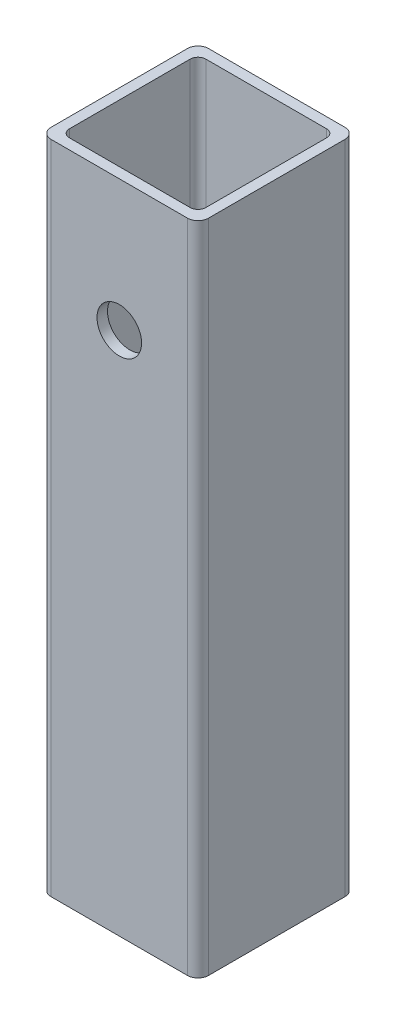
ISO-10303-21;
HEADER;
FILE_DESCRIPTION(('STEP AP214'),'2;1');
FILE_NAME('part.step','',(''),(''),'','','');
FILE_SCHEMA(('AUTOMOTIVE_DESIGN { 1 0 10303 214 1 1 1 1 }'));
ENDSEC;
DATA;
#1=APPLICATION_CONTEXT('core data for automotive mechanical design processes');
#2=APPLICATION_PROTOCOL_DEFINITION('international standard','automotive_design',2000,#1);
#3=PRODUCT_CONTEXT('',#1,'mechanical');
#4=PRODUCT('Part','Part','',(#3));
#5=PRODUCT_RELATED_PRODUCT_CATEGORY('part','',(#4));
#6=PRODUCT_DEFINITION_FORMATION('','',#4);
#7=PRODUCT_DEFINITION_CONTEXT('part definition',#1,'design');
#8=PRODUCT_DEFINITION('design','',#6,#7);
#9=PRODUCT_DEFINITION_SHAPE('','',#8);
#10=(LENGTH_UNIT() NAMED_UNIT(*) SI_UNIT(.MILLI.,.METRE.));
#11=(NAMED_UNIT(*) PLANE_ANGLE_UNIT() SI_UNIT($,.RADIAN.));
#12=(NAMED_UNIT(*) SI_UNIT($,.STERADIAN.) SOLID_ANGLE_UNIT());
#13=UNCERTAINTY_MEASURE_WITH_UNIT(LENGTH_MEASURE(1.E-05),#10,'distance_accuracy_value','');
#14=(GEOMETRIC_REPRESENTATION_CONTEXT(3) GLOBAL_UNCERTAINTY_ASSIGNED_CONTEXT((#13)) GLOBAL_UNIT_ASSIGNED_CONTEXT((#10,
#11,#12)) REPRESENTATION_CONTEXT('',''));
#15=CARTESIAN_POINT('',(0.,0.,0.));
#16=DIRECTION('',(0.,0.,1.));
#17=DIRECTION('',(1.,0.,0.));
#18=AXIS2_PLACEMENT_3D('',#15,#16,#17);
#19=CARTESIAN_POINT('',(-56.,-150.,55.9999999999995));
#20=DIRECTION('',(0.,1.,0.));
#21=DIRECTION('',(0.,0.,1.));
#22=AXIS2_PLACEMENT_3D('',#19,#20,#21);
#23=CYLINDRICAL_SURFACE('',#22,4.);
#24=DIRECTION('',(0.,1.,0.));
#25=VECTOR('',#24,1.);
#26=CARTESIAN_POINT('',(-56.,-150.,59.9999999999995));
#27=LINE('',#26,#25);
#28=CARTESIAN_POINT('',(-56.,-150.,59.9999999999995));
#29=VERTEX_POINT('',#28);
#30=CARTESIAN_POINT('',(-56.,100.,59.9999999999995));
#31=VERTEX_POINT('',#30);
#32=EDGE_CURVE('E268',#29,#31,#27,.T.);
#33=ORIENTED_EDGE('',*,*,#32,.T.);
#34=CARTESIAN_POINT('',(-56.,100.,55.9999999999995));
#35=DIRECTION('',(0.,1.,0.));
#36=DIRECTION('',(0.,0.,1.));
#37=AXIS2_PLACEMENT_3D('',#34,#35,#36);
#38=CIRCLE('',#37,4.);
#39=CARTESIAN_POINT('',(-60.,100.,55.9999999999995));
#40=VERTEX_POINT('',#39);
#41=EDGE_CURVE('E192',#40,#31,#38,.T.);
#42=ORIENTED_EDGE('',*,*,#41,.F.);
#43=DIRECTION('',(0.,1.,0.));
#44=VECTOR('',#43,1.);
#45=CARTESIAN_POINT('',(-60.,-150.,55.9999999999995));
#46=LINE('',#45,#44);
#47=CARTESIAN_POINT('',(-60.,-150.,55.9999999999995));
#48=VERTEX_POINT('',#47);
#49=EDGE_CURVE('E11',#48,#40,#46,.T.);
#50=ORIENTED_EDGE('',*,*,#49,.F.);
#51=CARTESIAN_POINT('',(-56.,-150.,55.9999999999995));
#52=DIRECTION('',(0.,1.,0.));
#53=DIRECTION('',(0.,0.,1.));
#54=AXIS2_PLACEMENT_3D('',#51,#52,#53);
#55=CIRCLE('',#54,4.);
#56=EDGE_CURVE('E235',#48,#29,#55,.T.);
#57=ORIENTED_EDGE('',*,*,#56,.T.);
#58=EDGE_LOOP('',(#33,#42,#50,#57));
#59=FACE_BOUND('',#58,.T.);
#60=ADVANCED_FACE('F34',(#59),#23,.T.);
#61=CARTESIAN_POINT('',(-60.,-150.,3.99999999999955));
#62=DIRECTION('',(-1.,0.,0.));
#63=DIRECTION('',(0.,0.,1.));
#64=AXIS2_PLACEMENT_3D('',#61,#62,#63);
#65=PLANE('',#64);
#66=ORIENTED_EDGE('',*,*,#49,.T.);
#67=DIRECTION('',(0.,0.,1.));
#68=VECTOR('',#67,1.);
#69=CARTESIAN_POINT('',(-60.,100.,3.99999999999955));
#70=LINE('',#69,#68);
#71=CARTESIAN_POINT('',(-60.,100.,3.99999999999955));
#72=VERTEX_POINT('',#71);
#73=EDGE_CURVE('E213',#72,#40,#70,.T.);
#74=ORIENTED_EDGE('',*,*,#73,.F.);
#75=DIRECTION('',(0.,1.,0.));
#76=VECTOR('',#75,1.);
#77=CARTESIAN_POINT('',(-60.,-150.,3.99999999999955));
#78=LINE('',#77,#76);
#79=CARTESIAN_POINT('',(-60.,-150.,3.99999999999955));
#80=VERTEX_POINT('',#79);
#81=EDGE_CURVE('E42',#80,#72,#78,.T.);
#82=ORIENTED_EDGE('',*,*,#81,.F.);
#83=DIRECTION('',(0.,0.,1.));
#84=VECTOR('',#83,1.);
#85=CARTESIAN_POINT('',(-60.,-150.,3.99999999999955));
#86=LINE('',#85,#84);
#87=EDGE_CURVE('E266',#80,#48,#86,.T.);
#88=ORIENTED_EDGE('',*,*,#87,.T.);
#89=EDGE_LOOP('',(#66,#74,#82,#88));
#90=FACE_BOUND('',#89,.T.);
#91=ADVANCED_FACE('F289',(#90),#65,.T.);
#92=CARTESIAN_POINT('',(-56.,-150.,3.99999999999955));
#93=DIRECTION('',(0.,1.,0.));
#94=DIRECTION('',(0.,0.,1.));
#95=AXIS2_PLACEMENT_3D('',#92,#93,#94);
#96=CYLINDRICAL_SURFACE('',#95,4.);
#97=ORIENTED_EDGE('',*,*,#81,.T.);
#98=CARTESIAN_POINT('',(-56.,100.,3.99999999999955));
#99=DIRECTION('',(0.,1.,0.));
#100=DIRECTION('',(0.,0.,1.));
#101=AXIS2_PLACEMENT_3D('',#98,#99,#100);
#102=CIRCLE('',#101,4.);
#103=CARTESIAN_POINT('',(-56.,100.,-4.49293380277993E-13));
#104=VERTEX_POINT('',#103);
#105=EDGE_CURVE('E210',#104,#72,#102,.T.);
#106=ORIENTED_EDGE('',*,*,#105,.F.);
#107=DIRECTION('',(0.,1.,0.));
#108=VECTOR('',#107,1.);
#109=CARTESIAN_POINT('',(-56.,-150.,-4.49293380277993E-13));
#110=LINE('',#109,#108);
#111=CARTESIAN_POINT('',(-56.,-150.,-4.49293380277993E-13));
#112=VERTEX_POINT('',#111);
#113=EDGE_CURVE('E271',#112,#104,#110,.T.);
#114=ORIENTED_EDGE('',*,*,#113,.F.);
#115=CARTESIAN_POINT('',(-56.,-150.,3.99999999999955));
#116=DIRECTION('',(0.,1.,0.));
#117=DIRECTION('',(0.,0.,1.));
#118=AXIS2_PLACEMENT_3D('',#115,#116,#117);
#119=CIRCLE('',#118,4.);
#120=EDGE_CURVE('E263',#112,#80,#119,.T.);
#121=ORIENTED_EDGE('',*,*,#120,.T.);
#122=EDGE_LOOP('',(#97,#106,#114,#121));
#123=FACE_BOUND('',#122,.T.);
#124=ADVANCED_FACE('F310',(#123),#96,.T.);
#125=CARTESIAN_POINT('',(-56.,-150.,-4.5102810375397E-13));
#126=DIRECTION('',(0.,0.,-1.));
#127=DIRECTION('',(-1.,0.,0.));
#128=AXIS2_PLACEMENT_3D('',#125,#126,#127);
#129=PLANE('',#128);
#130=CARTESIAN_POINT('',(-30.,50.,-4.5102810375397E-13));
#131=DIRECTION('',(0.,0.,1.));
#132=DIRECTION('',(1.,0.,0.));
#133=AXIS2_PLACEMENT_3D('',#130,#131,#132);
#134=CIRCLE('',#133,8.5);
#135=CARTESIAN_POINT('',(-21.5,50.,-4.5102810375397E-13));
#136=VERTEX_POINT('',#135);
#137=EDGE_CURVE('E488',#136,#136,#134,.T.);
#138=ORIENTED_EDGE('',*,*,#137,.T.);
#139=EDGE_LOOP('',(#138));
#140=FACE_BOUND('',#139,.T.);
#141=ORIENTED_EDGE('',*,*,#113,.T.);
#142=DIRECTION('',(-1.,0.,0.));
#143=VECTOR('',#142,1.);
#144=CARTESIAN_POINT('',(-56.,100.,-4.5102810375397E-13));
#145=LINE('',#144,#143);
#146=CARTESIAN_POINT('',(-4.,100.,-4.5102810375397E-13));
#147=VERTEX_POINT('',#146);
#148=EDGE_CURVE('E207',#147,#104,#145,.T.);
#149=ORIENTED_EDGE('',*,*,#148,.F.);
#150=DIRECTION('',(0.,1.,0.));
#151=VECTOR('',#150,1.);
#152=CARTESIAN_POINT('',(-4.,-150.,-4.5102810375397E-13));
#153=LINE('',#152,#151);
#154=CARTESIAN_POINT('',(-4.,-150.,-4.5102810375397E-13));
#155=VERTEX_POINT('',#154);
#156=EDGE_CURVE('E273',#155,#147,#153,.T.);
#157=ORIENTED_EDGE('',*,*,#156,.F.);
#158=DIRECTION('',(-1.,0.,0.));
#159=VECTOR('',#158,1.);
#160=CARTESIAN_POINT('',(-56.,-150.,-4.5102810375397E-13));
#161=LINE('',#160,#159);
#162=EDGE_CURVE('E260',#155,#112,#161,.T.);
#163=ORIENTED_EDGE('',*,*,#162,.T.);
#164=EDGE_LOOP('',(#141,#149,#157,#163));
#165=FACE_BOUND('',#164,.T.);
#166=ADVANCED_FACE('F307',(#140,#165),#129,.T.);
#167=CARTESIAN_POINT('',(-4.,-150.,3.99999999999955));
#168=DIRECTION('',(0.,1.,0.));
#169=DIRECTION('',(0.,0.,1.));
#170=AXIS2_PLACEMENT_3D('',#167,#168,#169);
#171=CYLINDRICAL_SURFACE('',#170,4.);
#172=ORIENTED_EDGE('',*,*,#156,.T.);
#173=CARTESIAN_POINT('',(-4.,100.,3.99999999999955));
#174=DIRECTION('',(0.,1.,0.));
#175=DIRECTION('',(0.,0.,-1.));
#176=AXIS2_PLACEMENT_3D('',#173,#174,#175);
#177=CIRCLE('',#176,4.);
#178=CARTESIAN_POINT('',(0.,100.,3.99999999999955));
#179=VERTEX_POINT('',#178);
#180=EDGE_CURVE('E204',#179,#147,#177,.T.);
#181=ORIENTED_EDGE('',*,*,#180,.F.);
#182=DIRECTION('',(0.,1.,0.));
#183=VECTOR('',#182,1.);
#184=CARTESIAN_POINT('',(0.,-150.,3.99999999999955));
#185=LINE('',#184,#183);
#186=CARTESIAN_POINT('',(0.,-150.,3.99999999999955));
#187=VERTEX_POINT('',#186);
#188=EDGE_CURVE('E275',#187,#179,#185,.T.);
#189=ORIENTED_EDGE('',*,*,#188,.F.);
#190=CARTESIAN_POINT('',(-4.,-150.,3.99999999999955));
#191=DIRECTION('',(0.,1.,0.));
#192=DIRECTION('',(0.,0.,-1.));
#193=AXIS2_PLACEMENT_3D('',#190,#191,#192);
#194=CIRCLE('',#193,4.);
#195=EDGE_CURVE('E257',#187,#155,#194,.T.);
#196=ORIENTED_EDGE('',*,*,#195,.T.);
#197=EDGE_LOOP('',(#172,#181,#189,#196));
#198=FACE_BOUND('',#197,.T.);
#199=ADVANCED_FACE('F305',(#198),#171,.T.);
#200=CARTESIAN_POINT('',(0.,-150.,3.99999999999955));
#201=DIRECTION('',(1.,0.,0.));
#202=DIRECTION('',(0.,0.,-1.));
#203=AXIS2_PLACEMENT_3D('',#200,#201,#202);
#204=PLANE('',#203);
#205=ORIENTED_EDGE('',*,*,#188,.T.);
#206=DIRECTION('',(0.,0.,-1.));
#207=VECTOR('',#206,1.);
#208=CARTESIAN_POINT('',(0.,100.,3.99999999999955));
#209=LINE('',#208,#207);
#210=CARTESIAN_POINT('',(0.,100.,55.9999999999995));
#211=VERTEX_POINT('',#210);
#212=EDGE_CURVE('E201',#211,#179,#209,.T.);
#213=ORIENTED_EDGE('',*,*,#212,.F.);
#214=DIRECTION('',(0.,1.,0.));
#215=VECTOR('',#214,1.);
#216=CARTESIAN_POINT('',(0.,-150.,55.9999999999995));
#217=LINE('',#216,#215);
#218=CARTESIAN_POINT('',(0.,-150.,55.9999999999995));
#219=VERTEX_POINT('',#218);
#220=EDGE_CURVE('E277',#219,#211,#217,.T.);
#221=ORIENTED_EDGE('',*,*,#220,.F.);
#222=DIRECTION('',(0.,0.,-1.));
#223=VECTOR('',#222,1.);
#224=CARTESIAN_POINT('',(0.,-150.,3.99999999999955));
#225=LINE('',#224,#223);
#226=EDGE_CURVE('E254',#219,#187,#225,.T.);
#227=ORIENTED_EDGE('',*,*,#226,.T.);
#228=EDGE_LOOP('',(#205,#213,#221,#227));
#229=FACE_BOUND('',#228,.T.);
#230=ADVANCED_FACE('F303',(#229),#204,.T.);
#231=CARTESIAN_POINT('',(-4.,-150.,55.9999999999995));
#232=DIRECTION('',(0.,1.,0.));
#233=DIRECTION('',(0.,0.,1.));
#234=AXIS2_PLACEMENT_3D('',#231,#232,#233);
#235=CYLINDRICAL_SURFACE('',#234,4.);
#236=ORIENTED_EDGE('',*,*,#220,.T.);
#237=CARTESIAN_POINT('',(-4.,100.,55.9999999999995));
#238=DIRECTION('',(0.,1.,0.));
#239=DIRECTION('',(0.,0.,1.));
#240=AXIS2_PLACEMENT_3D('',#237,#238,#239);
#241=CIRCLE('',#240,4.);
#242=CARTESIAN_POINT('',(-4.,100.,59.9999999999995));
#243=VERTEX_POINT('',#242);
#244=EDGE_CURVE('E198',#243,#211,#241,.T.);
#245=ORIENTED_EDGE('',*,*,#244,.F.);
#246=DIRECTION('',(0.,1.,0.));
#247=VECTOR('',#246,1.);
#248=CARTESIAN_POINT('',(-4.,-150.,59.9999999999995));
#249=LINE('',#248,#247);
#250=CARTESIAN_POINT('',(-4.,-150.,59.9999999999995));
#251=VERTEX_POINT('',#250);
#252=EDGE_CURVE('E279',#251,#243,#249,.T.);
#253=ORIENTED_EDGE('',*,*,#252,.F.);
#254=CARTESIAN_POINT('',(-4.,-150.,55.9999999999995));
#255=DIRECTION('',(0.,1.,0.));
#256=DIRECTION('',(0.,0.,1.));
#257=AXIS2_PLACEMENT_3D('',#254,#255,#256);
#258=CIRCLE('',#257,4.);
#259=EDGE_CURVE('E251',#251,#219,#258,.T.);
#260=ORIENTED_EDGE('',*,*,#259,.T.);
#261=EDGE_LOOP('',(#236,#245,#253,#260));
#262=FACE_BOUND('',#261,.T.);
#263=ADVANCED_FACE('F299',(#262),#235,.T.);
#264=CARTESIAN_POINT('',(-56.,-150.,59.9999999999995));
#265=DIRECTION('',(0.,0.,1.));
#266=DIRECTION('',(1.,0.,0.));
#267=AXIS2_PLACEMENT_3D('',#264,#265,#266);
#268=PLANE('',#267);
#269=CARTESIAN_POINT('',(-30.,50.,59.9999999999995));
#270=DIRECTION('',(0.,0.,1.));
#271=DIRECTION('',(1.,0.,0.));
#272=AXIS2_PLACEMENT_3D('',#269,#270,#271);
#273=CIRCLE('',#272,8.5);
#274=CARTESIAN_POINT('',(-21.5,50.,59.9999999999995));
#275=VERTEX_POINT('',#274);
#276=EDGE_CURVE('E493',#275,#275,#273,.T.);
#277=ORIENTED_EDGE('',*,*,#276,.F.);
#278=EDGE_LOOP('',(#277));
#279=FACE_BOUND('',#278,.T.);
#280=ORIENTED_EDGE('',*,*,#252,.T.);
#281=DIRECTION('',(1.,0.,0.));
#282=VECTOR('',#281,1.);
#283=CARTESIAN_POINT('',(-56.,100.,59.9999999999995));
#284=LINE('',#283,#282);
#285=EDGE_CURVE('E195',#31,#243,#284,.T.);
#286=ORIENTED_EDGE('',*,*,#285,.F.);
#287=ORIENTED_EDGE('',*,*,#32,.F.);
#288=DIRECTION('',(1.,0.,0.));
#289=VECTOR('',#288,1.);
#290=CARTESIAN_POINT('',(-56.,-150.,59.9999999999995));
#291=LINE('',#290,#289);
#292=EDGE_CURVE('E248',#29,#251,#291,.T.);
#293=ORIENTED_EDGE('',*,*,#292,.T.);
#294=EDGE_LOOP('',(#280,#286,#287,#293));
#295=FACE_BOUND('',#294,.T.);
#296=ADVANCED_FACE('F283',(#279,#295),#268,.T.);
#297=CARTESIAN_POINT('',(-56.,-150.,55.9999999999995));
#298=DIRECTION('',(0.,1.,0.));
#299=DIRECTION('',(0.,0.,1.));
#300=AXIS2_PLACEMENT_3D('',#297,#298,#299);
#301=PLANE('',#300);
#302=DIRECTION('',(0.,0.,1.));
#303=VECTOR('',#302,1.);
#304=CARTESIAN_POINT('',(-56.,-150.,6.99999999999953));
#305=LINE('',#304,#303);
#306=CARTESIAN_POINT('',(-56.,-150.,6.99999999999953));
#307=VERTEX_POINT('',#306);
#308=CARTESIAN_POINT('',(-56.,-150.,52.9999999999996));
#309=VERTEX_POINT('',#308);
#310=EDGE_CURVE('E159',#307,#309,#305,.T.);
#311=ORIENTED_EDGE('',*,*,#310,.T.);
#312=CARTESIAN_POINT('',(-53.,-150.,52.9999999999996));
#313=DIRECTION('',(0.,1.,0.));
#314=DIRECTION('',(0.,0.,1.));
#315=AXIS2_PLACEMENT_3D('',#312,#313,#314);
#316=CIRCLE('',#315,2.99999999999999);
#317=CARTESIAN_POINT('',(-53.,-150.,55.9999999999996));
#318=VERTEX_POINT('',#317);
#319=EDGE_CURVE('E216',#309,#318,#316,.T.);
#320=ORIENTED_EDGE('',*,*,#319,.T.);
#321=DIRECTION('',(1.,0.,0.));
#322=VECTOR('',#321,1.);
#323=CARTESIAN_POINT('',(-53.,-150.,55.9999999999996));
#324=LINE('',#323,#322);
#325=CARTESIAN_POINT('',(-7.,-150.,55.9999999999996));
#326=VERTEX_POINT('',#325);
#327=EDGE_CURVE('E154',#318,#326,#324,.T.);
#328=ORIENTED_EDGE('',*,*,#327,.T.);
#329=CARTESIAN_POINT('',(-7.,-150.,52.9999999999996));
#330=DIRECTION('',(0.,1.,0.));
#331=DIRECTION('',(0.,0.,1.));
#332=AXIS2_PLACEMENT_3D('',#329,#330,#331);
#333=CIRCLE('',#332,2.99999999999999);
#334=CARTESIAN_POINT('',(-4.00000000000001,-150.,52.9999999999996));
#335=VERTEX_POINT('',#334);
#336=EDGE_CURVE('E50',#326,#335,#333,.T.);
#337=ORIENTED_EDGE('',*,*,#336,.T.);
#338=DIRECTION('',(0.,0.,-1.));
#339=VECTOR('',#338,1.);
#340=CARTESIAN_POINT('',(-4.00000000000001,-150.,6.99999999999953));
#341=LINE('',#340,#339);
#342=CARTESIAN_POINT('',(-4.,-150.,6.99999999999953));
#343=VERTEX_POINT('',#342);
#344=EDGE_CURVE('E220',#335,#343,#341,.T.);
#345=ORIENTED_EDGE('',*,*,#344,.T.);
#346=CARTESIAN_POINT('',(-7.,-150.,6.99999999999953));
#347=DIRECTION('',(0.,1.,0.));
#348=DIRECTION('',(0.,0.,-1.));
#349=AXIS2_PLACEMENT_3D('',#346,#347,#348);
#350=CIRCLE('',#349,3.);
#351=CARTESIAN_POINT('',(-7.,-150.,3.99999999999954));
#352=VERTEX_POINT('',#351);
#353=EDGE_CURVE('E223',#343,#352,#350,.T.);
#354=ORIENTED_EDGE('',*,*,#353,.T.);
#355=DIRECTION('',(-1.,0.,0.));
#356=VECTOR('',#355,1.);
#357=CARTESIAN_POINT('',(-53.,-150.,3.99999999999954));
#358=LINE('',#357,#356);
#359=CARTESIAN_POINT('',(-53.,-150.,3.99999999999954));
#360=VERTEX_POINT('',#359);
#361=EDGE_CURVE('E226',#352,#360,#358,.T.);
#362=ORIENTED_EDGE('',*,*,#361,.T.);
#363=CARTESIAN_POINT('',(-53.,-150.,6.99999999999953));
#364=DIRECTION('',(0.,1.,0.));
#365=DIRECTION('',(0.,0.,1.));
#366=AXIS2_PLACEMENT_3D('',#363,#364,#365);
#367=CIRCLE('',#366,3.);
#368=EDGE_CURVE('E229',#360,#307,#367,.T.);
#369=ORIENTED_EDGE('',*,*,#368,.T.);
#370=EDGE_LOOP('',(#311,#320,#328,#337,#345,#354,#362,#369));
#371=FACE_BOUND('',#370,.T.);
#372=ORIENTED_EDGE('',*,*,#56,.F.);
#373=ORIENTED_EDGE('',*,*,#87,.F.);
#374=ORIENTED_EDGE('',*,*,#120,.F.);
#375=ORIENTED_EDGE('',*,*,#162,.F.);
#376=ORIENTED_EDGE('',*,*,#195,.F.);
#377=ORIENTED_EDGE('',*,*,#226,.F.);
#378=ORIENTED_EDGE('',*,*,#259,.F.);
#379=ORIENTED_EDGE('',*,*,#292,.F.);
#380=EDGE_LOOP('',(#372,#373,#374,#375,#376,#377,#378,#379));
#381=FACE_BOUND('',#380,.T.);
#382=ADVANCED_FACE('F293',(#371,#381),#301,.F.);
#383=CARTESIAN_POINT('',(-53.,-150.,52.9999999999996));
#384=DIRECTION('',(0.,1.,0.));
#385=DIRECTION('',(0.,0.,1.));
#386=AXIS2_PLACEMENT_3D('',#383,#384,#385);
#387=CYLINDRICAL_SURFACE('',#386,2.99999999999999);
#388=DIRECTION('',(0.,1.,0.));
#389=VECTOR('',#388,1.);
#390=CARTESIAN_POINT('',(-56.,-150.,52.9999999999996));
#391=LINE('',#390,#389);
#392=CARTESIAN_POINT('',(-56.,100.,52.9999999999996));
#393=VERTEX_POINT('',#392);
#394=EDGE_CURVE('E164',#309,#393,#391,.T.);
#395=ORIENTED_EDGE('',*,*,#394,.T.);
#396=CARTESIAN_POINT('',(-53.,100.,52.9999999999996));
#397=DIRECTION('',(0.,1.,0.));
#398=DIRECTION('',(0.,0.,1.));
#399=AXIS2_PLACEMENT_3D('',#396,#397,#398);
#400=CIRCLE('',#399,2.99999999999999);
#401=CARTESIAN_POINT('',(-53.,100.,55.9999999999996));
#402=VERTEX_POINT('',#401);
#403=EDGE_CURVE('E162',#393,#402,#400,.T.);
#404=ORIENTED_EDGE('',*,*,#403,.T.);
#405=DIRECTION('',(0.,1.,0.));
#406=VECTOR('',#405,1.);
#407=CARTESIAN_POINT('',(-53.,-150.,55.9999999999996));
#408=LINE('',#407,#406);
#409=EDGE_CURVE('E147',#318,#402,#408,.T.);
#410=ORIENTED_EDGE('',*,*,#409,.F.);
#411=ORIENTED_EDGE('',*,*,#319,.F.);
#412=EDGE_LOOP('',(#395,#404,#410,#411));
#413=FACE_BOUND('',#412,.T.);
#414=ADVANCED_FACE('F163',(#413),#387,.F.);
#415=CARTESIAN_POINT('',(-56.,-150.,6.99999999999953));
#416=DIRECTION('',(-1.,0.,0.));
#417=DIRECTION('',(0.,0.,1.));
#418=AXIS2_PLACEMENT_3D('',#415,#416,#417);
#419=PLANE('',#418);
#420=DIRECTION('',(0.,1.,0.));
#421=VECTOR('',#420,1.);
#422=CARTESIAN_POINT('',(-56.,-150.,6.99999999999953));
#423=LINE('',#422,#421);
#424=CARTESIAN_POINT('',(-56.,100.,6.99999999999953));
#425=VERTEX_POINT('',#424);
#426=EDGE_CURVE('E236',#307,#425,#423,.T.);
#427=ORIENTED_EDGE('',*,*,#426,.T.);
#428=DIRECTION('',(0.,0.,1.));
#429=VECTOR('',#428,1.);
#430=CARTESIAN_POINT('',(-56.,100.,6.99999999999953));
#431=LINE('',#430,#429);
#432=EDGE_CURVE('E190',#425,#393,#431,.T.);
#433=ORIENTED_EDGE('',*,*,#432,.T.);
#434=ORIENTED_EDGE('',*,*,#394,.F.);
#435=ORIENTED_EDGE('',*,*,#310,.F.);
#436=EDGE_LOOP('',(#427,#433,#434,#435));
#437=FACE_BOUND('',#436,.T.);
#438=ADVANCED_FACE('F376',(#437),#419,.F.);
#439=CARTESIAN_POINT('',(-53.,-150.,6.99999999999953));
#440=DIRECTION('',(0.,1.,0.));
#441=DIRECTION('',(0.,0.,1.));
#442=AXIS2_PLACEMENT_3D('',#439,#440,#441);
#443=CYLINDRICAL_SURFACE('',#442,3.);
#444=DIRECTION('',(0.,1.,0.));
#445=VECTOR('',#444,1.);
#446=CARTESIAN_POINT('',(-53.,-150.,3.99999999999954));
#447=LINE('',#446,#445);
#448=CARTESIAN_POINT('',(-53.,100.,3.99999999999954));
#449=VERTEX_POINT('',#448);
#450=EDGE_CURVE('E238',#360,#449,#447,.T.);
#451=ORIENTED_EDGE('',*,*,#450,.T.);
#452=CARTESIAN_POINT('',(-53.,100.,6.99999999999953));
#453=DIRECTION('',(0.,1.,0.));
#454=DIRECTION('',(0.,0.,1.));
#455=AXIS2_PLACEMENT_3D('',#452,#453,#454);
#456=CIRCLE('',#455,3.);
#457=EDGE_CURVE('E187',#449,#425,#456,.T.);
#458=ORIENTED_EDGE('',*,*,#457,.T.);
#459=ORIENTED_EDGE('',*,*,#426,.F.);
#460=ORIENTED_EDGE('',*,*,#368,.F.);
#461=EDGE_LOOP('',(#451,#458,#459,#460));
#462=FACE_BOUND('',#461,.T.);
#463=ADVANCED_FACE('F385',(#462),#443,.F.);
#464=CARTESIAN_POINT('',(-53.,-150.,3.99999999999954));
#465=DIRECTION('',(0.,0.,-1.));
#466=DIRECTION('',(-1.,0.,0.));
#467=AXIS2_PLACEMENT_3D('',#464,#465,#466);
#468=PLANE('',#467);
#469=CARTESIAN_POINT('',(-30.,50.,3.99999999999954));
#470=DIRECTION('',(0.,0.,-1.));
#471=DIRECTION('',(-1.,0.,0.));
#472=AXIS2_PLACEMENT_3D('',#469,#470,#471);
#473=CIRCLE('',#472,8.5);
#474=CARTESIAN_POINT('',(-38.5,50.,3.99999999999954));
#475=VERTEX_POINT('',#474);
#476=EDGE_CURVE('E168',#475,#475,#473,.T.);
#477=ORIENTED_EDGE('',*,*,#476,.T.);
#478=EDGE_LOOP('',(#477));
#479=FACE_BOUND('',#478,.T.);
#480=DIRECTION('',(0.,1.,0.));
#481=VECTOR('',#480,1.);
#482=CARTESIAN_POINT('',(-7.,-150.,3.99999999999954));
#483=LINE('',#482,#481);
#484=CARTESIAN_POINT('',(-7.,100.,3.99999999999954));
#485=VERTEX_POINT('',#484);
#486=EDGE_CURVE('E240',#352,#485,#483,.T.);
#487=ORIENTED_EDGE('',*,*,#486,.T.);
#488=DIRECTION('',(-1.,0.,0.));
#489=VECTOR('',#488,1.);
#490=CARTESIAN_POINT('',(-53.,100.,3.99999999999954));
#491=LINE('',#490,#489);
#492=EDGE_CURVE('E184',#485,#449,#491,.T.);
#493=ORIENTED_EDGE('',*,*,#492,.T.);
#494=ORIENTED_EDGE('',*,*,#450,.F.);
#495=ORIENTED_EDGE('',*,*,#361,.F.);
#496=EDGE_LOOP('',(#487,#493,#494,#495));
#497=FACE_BOUND('',#496,.T.);
#498=ADVANCED_FACE('F395',(#479,#497),#468,.F.);
#499=CARTESIAN_POINT('',(-7.,-150.,6.99999999999953));
#500=DIRECTION('',(0.,1.,0.));
#501=DIRECTION('',(0.,0.,1.));
#502=AXIS2_PLACEMENT_3D('',#499,#500,#501);
#503=CYLINDRICAL_SURFACE('',#502,3.);
#504=DIRECTION('',(0.,1.,0.));
#505=VECTOR('',#504,1.);
#506=CARTESIAN_POINT('',(-4.,-150.,6.99999999999953));
#507=LINE('',#506,#505);
#508=CARTESIAN_POINT('',(-4.,100.,6.99999999999953));
#509=VERTEX_POINT('',#508);
#510=EDGE_CURVE('E242',#343,#509,#507,.T.);
#511=ORIENTED_EDGE('',*,*,#510,.T.);
#512=CARTESIAN_POINT('',(-7.,100.,6.99999999999953));
#513=DIRECTION('',(0.,1.,0.));
#514=DIRECTION('',(0.,0.,-1.));
#515=AXIS2_PLACEMENT_3D('',#512,#513,#514);
#516=CIRCLE('',#515,3.);
#517=EDGE_CURVE('E181',#509,#485,#516,.T.);
#518=ORIENTED_EDGE('',*,*,#517,.T.);
#519=ORIENTED_EDGE('',*,*,#486,.F.);
#520=ORIENTED_EDGE('',*,*,#353,.F.);
#521=EDGE_LOOP('',(#511,#518,#519,#520));
#522=FACE_BOUND('',#521,.T.);
#523=ADVANCED_FACE('F403',(#522),#503,.F.);
#524=CARTESIAN_POINT('',(-4.00000000000001,-150.,6.99999999999953));
#525=DIRECTION('',(1.,0.,0.));
#526=DIRECTION('',(0.,0.,-1.));
#527=AXIS2_PLACEMENT_3D('',#524,#525,#526);
#528=PLANE('',#527);
#529=DIRECTION('',(0.,1.,0.));
#530=VECTOR('',#529,1.);
#531=CARTESIAN_POINT('',(-4.00000000000001,-150.,52.9999999999996));
#532=LINE('',#531,#530);
#533=CARTESIAN_POINT('',(-4.00000000000001,100.,52.9999999999996));
#534=VERTEX_POINT('',#533);
#535=EDGE_CURVE('E244',#335,#534,#532,.T.);
#536=ORIENTED_EDGE('',*,*,#535,.T.);
#537=DIRECTION('',(0.,0.,-1.));
#538=VECTOR('',#537,1.);
#539=CARTESIAN_POINT('',(-4.00000000000001,100.,6.99999999999953));
#540=LINE('',#539,#538);
#541=EDGE_CURVE('E175',#534,#509,#540,.T.);
#542=ORIENTED_EDGE('',*,*,#541,.T.);
#543=ORIENTED_EDGE('',*,*,#510,.F.);
#544=ORIENTED_EDGE('',*,*,#344,.F.);
#545=EDGE_LOOP('',(#536,#542,#543,#544));
#546=FACE_BOUND('',#545,.T.);
#547=ADVANCED_FACE('F408',(#546),#528,.F.);
#548=CARTESIAN_POINT('',(-7.,-150.,52.9999999999996));
#549=DIRECTION('',(0.,1.,0.));
#550=DIRECTION('',(0.,0.,1.));
#551=AXIS2_PLACEMENT_3D('',#548,#549,#550);
#552=CYLINDRICAL_SURFACE('',#551,2.99999999999999);
#553=DIRECTION('',(0.,1.,0.));
#554=VECTOR('',#553,1.);
#555=CARTESIAN_POINT('',(-7.,-150.,55.9999999999996));
#556=LINE('',#555,#554);
#557=CARTESIAN_POINT('',(-7.,100.,55.9999999999996));
#558=VERTEX_POINT('',#557);
#559=EDGE_CURVE('E158',#326,#558,#556,.T.);
#560=ORIENTED_EDGE('',*,*,#559,.T.);
#561=CARTESIAN_POINT('',(-7.,100.,52.9999999999996));
#562=DIRECTION('',(0.,1.,0.));
#563=DIRECTION('',(0.,0.,1.));
#564=AXIS2_PLACEMENT_3D('',#561,#562,#563);
#565=CIRCLE('',#564,2.99999999999999);
#566=EDGE_CURVE('E173',#558,#534,#565,.T.);
#567=ORIENTED_EDGE('',*,*,#566,.T.);
#568=ORIENTED_EDGE('',*,*,#535,.F.);
#569=ORIENTED_EDGE('',*,*,#336,.F.);
#570=EDGE_LOOP('',(#560,#567,#568,#569));
#571=FACE_BOUND('',#570,.T.);
#572=ADVANCED_FACE('F418',(#571),#552,.F.);
#573=CARTESIAN_POINT('',(-53.,-150.,55.9999999999996));
#574=DIRECTION('',(0.,0.,1.));
#575=DIRECTION('',(1.,0.,0.));
#576=AXIS2_PLACEMENT_3D('',#573,#574,#575);
#577=PLANE('',#576);
#578=CARTESIAN_POINT('',(-30.,50.,55.9999999999996));
#579=DIRECTION('',(0.,0.,1.));
#580=DIRECTION('',(1.,0.,0.));
#581=AXIS2_PLACEMENT_3D('',#578,#579,#580);
#582=CIRCLE('',#581,8.5);
#583=CARTESIAN_POINT('',(-21.5,50.,55.9999999999996));
#584=VERTEX_POINT('',#583);
#585=EDGE_CURVE('E37',#584,#584,#582,.T.);
#586=ORIENTED_EDGE('',*,*,#585,.T.);
#587=EDGE_LOOP('',(#586));
#588=FACE_BOUND('',#587,.T.);
#589=ORIENTED_EDGE('',*,*,#409,.T.);
#590=DIRECTION('',(1.,0.,0.));
#591=VECTOR('',#590,1.);
#592=CARTESIAN_POINT('',(-53.,100.,55.9999999999996));
#593=LINE('',#592,#591);
#594=EDGE_CURVE('E151',#402,#558,#593,.T.);
#595=ORIENTED_EDGE('',*,*,#594,.T.);
#596=ORIENTED_EDGE('',*,*,#559,.F.);
#597=ORIENTED_EDGE('',*,*,#327,.F.);
#598=EDGE_LOOP('',(#589,#595,#596,#597));
#599=FACE_BOUND('',#598,.T.);
#600=ADVANCED_FACE('F149',(#588,#599),#577,.F.);
#601=CARTESIAN_POINT('',(-56.,100.,55.9999999999995));
#602=DIRECTION('',(0.,1.,0.));
#603=DIRECTION('',(0.,0.,1.));
#604=AXIS2_PLACEMENT_3D('',#601,#602,#603);
#605=PLANE('',#604);
#606=ORIENTED_EDGE('',*,*,#41,.T.);
#607=ORIENTED_EDGE('',*,*,#285,.T.);
#608=ORIENTED_EDGE('',*,*,#244,.T.);
#609=ORIENTED_EDGE('',*,*,#212,.T.);
#610=ORIENTED_EDGE('',*,*,#180,.T.);
#611=ORIENTED_EDGE('',*,*,#148,.T.);
#612=ORIENTED_EDGE('',*,*,#105,.T.);
#613=ORIENTED_EDGE('',*,*,#73,.T.);
#614=EDGE_LOOP('',(#606,#607,#608,#609,#610,#611,#612,#613));
#615=FACE_BOUND('',#614,.T.);
#616=ORIENTED_EDGE('',*,*,#594,.F.);
#617=ORIENTED_EDGE('',*,*,#403,.F.);
#618=ORIENTED_EDGE('',*,*,#432,.F.);
#619=ORIENTED_EDGE('',*,*,#457,.F.);
#620=ORIENTED_EDGE('',*,*,#492,.F.);
#621=ORIENTED_EDGE('',*,*,#517,.F.);
#622=ORIENTED_EDGE('',*,*,#541,.F.);
#623=ORIENTED_EDGE('',*,*,#566,.F.);
#624=EDGE_LOOP('',(#616,#617,#618,#619,#620,#621,#622,#623));
#625=FACE_BOUND('',#624,.T.);
#626=ADVANCED_FACE('F170',(#615,#625),#605,.T.);
#627=CARTESIAN_POINT('',(-30.,50.,-4.5102810375397E-13));
#628=DIRECTION('',(0.,0.,1.));
#629=DIRECTION('',(1.,0.,0.));
#630=AXIS2_PLACEMENT_3D('',#627,#628,#629);
#631=CYLINDRICAL_SURFACE('',#630,8.5);
#632=ORIENTED_EDGE('',*,*,#276,.T.);
#633=EDGE_LOOP('',(#632));
#634=FACE_BOUND('',#633,.T.);
#635=ORIENTED_EDGE('',*,*,#585,.F.);
#636=EDGE_LOOP('',(#635));
#637=FACE_BOUND('',#636,.T.);
#638=ADVANCED_FACE('F438',(#634,#637),#631,.F.);
#639=ORIENTED_EDGE('',*,*,#137,.F.);
#640=EDGE_LOOP('',(#639));
#641=FACE_BOUND('',#640,.T.);
#642=ORIENTED_EDGE('',*,*,#476,.F.);
#643=EDGE_LOOP('',(#642));
#644=FACE_BOUND('',#643,.T.);
#645=ADVANCED_FACE('F472',(#641,#644),#631,.F.);
#646=CLOSED_SHELL('',(#60,#91,#124,#166,#199,#230,#263,#296,#382,#414,#438,#463,#498,#523,#547,
#572,#600,#626,#638,#645));
#647=MANIFOLD_SOLID_BREP('B2',#646);
#648=ADVANCED_BREP_SHAPE_REPRESENTATION('',(#18,#647),#14);
#649=SHAPE_DEFINITION_REPRESENTATION(#9,#648);
ENDSEC;
END-ISO-10303-21;
